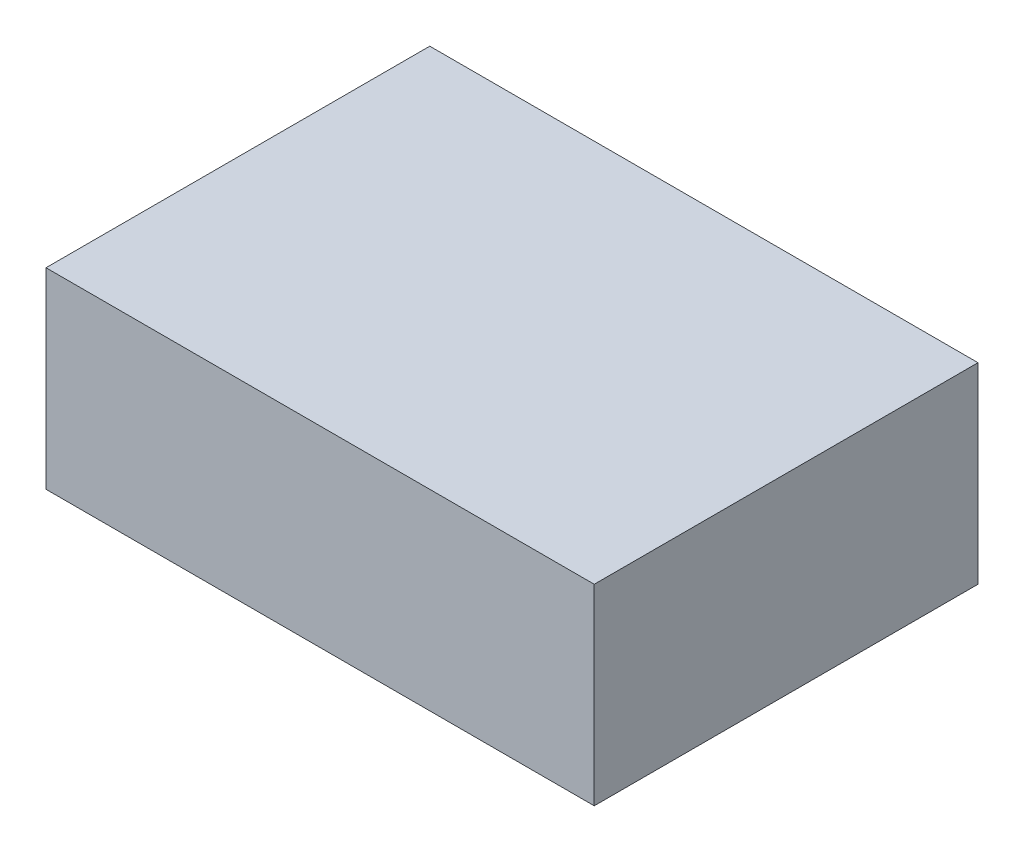
ISO-10303-21;
HEADER;
FILE_DESCRIPTION(('STEP AP214'),'2;1');
FILE_NAME('part.step','',(''),(''),'','','');
FILE_SCHEMA(('AUTOMOTIVE_DESIGN { 1 0 10303 214 1 1 1 1 }'));
ENDSEC;
DATA;
#1=APPLICATION_CONTEXT('core data for automotive mechanical design processes');
#2=APPLICATION_PROTOCOL_DEFINITION('international standard','automotive_design',2000,#1);
#3=PRODUCT_CONTEXT('',#1,'mechanical');
#4=PRODUCT('Part','Part','',(#3));
#5=PRODUCT_RELATED_PRODUCT_CATEGORY('part','',(#4));
#6=PRODUCT_DEFINITION_FORMATION('','',#4);
#7=PRODUCT_DEFINITION_CONTEXT('part definition',#1,'design');
#8=PRODUCT_DEFINITION('design','',#6,#7);
#9=PRODUCT_DEFINITION_SHAPE('','',#8);
#10=(LENGTH_UNIT() NAMED_UNIT(*) SI_UNIT(.MILLI.,.METRE.));
#11=(NAMED_UNIT(*) PLANE_ANGLE_UNIT() SI_UNIT($,.RADIAN.));
#12=(NAMED_UNIT(*) SI_UNIT($,.STERADIAN.) SOLID_ANGLE_UNIT());
#13=UNCERTAINTY_MEASURE_WITH_UNIT(LENGTH_MEASURE(1.E-05),#10,'distance_accuracy_value','');
#14=(GEOMETRIC_REPRESENTATION_CONTEXT(3) GLOBAL_UNCERTAINTY_ASSIGNED_CONTEXT((#13)) GLOBAL_UNIT_ASSIGNED_CONTEXT((#10,
#11,#12)) REPRESENTATION_CONTEXT('',''));
#15=CARTESIAN_POINT('',(0.,0.,0.));
#16=DIRECTION('',(0.,0.,1.));
#17=DIRECTION('',(1.,0.,0.));
#18=AXIS2_PLACEMENT_3D('',#15,#16,#17);
#19=CARTESIAN_POINT('',(50.,35.,-35.));
#20=DIRECTION('',(-1.,0.,0.));
#21=DIRECTION('',(0.,0.,1.));
#22=AXIS2_PLACEMENT_3D('',#19,#20,#21);
#23=PLANE('',#22);
#24=DIRECTION('',(0.,0.,-1.));
#25=VECTOR('',#24,1.);
#26=CARTESIAN_POINT('',(50.,0.,-35.));
#27=LINE('',#26,#25);
#28=CARTESIAN_POINT('',(50.,0.,35.));
#29=VERTEX_POINT('',#28);
#30=CARTESIAN_POINT('',(50.,0.,-35.));
#31=VERTEX_POINT('',#30);
#32=EDGE_CURVE('E97',#29,#31,#27,.T.);
#33=ORIENTED_EDGE('',*,*,#32,.T.);
#34=DIRECTION('',(0.,-1.,0.));
#35=VECTOR('',#34,1.);
#36=CARTESIAN_POINT('',(50.,35.,-35.));
#37=LINE('',#36,#35);
#38=CARTESIAN_POINT('',(50.,35.,-35.));
#39=VERTEX_POINT('',#38);
#40=EDGE_CURVE('E11',#39,#31,#37,.T.);
#41=ORIENTED_EDGE('',*,*,#40,.F.);
#42=DIRECTION('',(0.,0.,-1.));
#43=VECTOR('',#42,1.);
#44=CARTESIAN_POINT('',(50.,35.,-35.));
#45=LINE('',#44,#43);
#46=CARTESIAN_POINT('',(50.,35.,35.));
#47=VERTEX_POINT('',#46);
#48=EDGE_CURVE('E85',#47,#39,#45,.T.);
#49=ORIENTED_EDGE('',*,*,#48,.F.);
#50=DIRECTION('',(0.,-1.,0.));
#51=VECTOR('',#50,1.);
#52=CARTESIAN_POINT('',(50.,35.,35.));
#53=LINE('',#52,#51);
#54=EDGE_CURVE('E93',#47,#29,#53,.T.);
#55=ORIENTED_EDGE('',*,*,#54,.T.);
#56=EDGE_LOOP('',(#33,#41,#49,#55));
#57=FACE_BOUND('',#56,.T.);
#58=ADVANCED_FACE('F34',(#57),#23,.F.);
#59=CARTESIAN_POINT('',(-50.,35.,-35.));
#60=DIRECTION('',(0.,0.,1.));
#61=DIRECTION('',(1.,0.,0.));
#62=AXIS2_PLACEMENT_3D('',#59,#60,#61);
#63=PLANE('',#62);
#64=DIRECTION('',(-1.,0.,0.));
#65=VECTOR('',#64,1.);
#66=CARTESIAN_POINT('',(-50.,0.,-35.));
#67=LINE('',#66,#65);
#68=CARTESIAN_POINT('',(-50.,0.,-35.));
#69=VERTEX_POINT('',#68);
#70=EDGE_CURVE('E89',#31,#69,#67,.T.);
#71=ORIENTED_EDGE('',*,*,#70,.T.);
#72=DIRECTION('',(0.,-1.,0.));
#73=VECTOR('',#72,1.);
#74=CARTESIAN_POINT('',(-50.,35.,-35.));
#75=LINE('',#74,#73);
#76=CARTESIAN_POINT('',(-50.,35.,-35.));
#77=VERTEX_POINT('',#76);
#78=EDGE_CURVE('E42',#77,#69,#75,.T.);
#79=ORIENTED_EDGE('',*,*,#78,.F.);
#80=DIRECTION('',(-1.,0.,0.));
#81=VECTOR('',#80,1.);
#82=CARTESIAN_POINT('',(-50.,35.,-35.));
#83=LINE('',#82,#81);
#84=EDGE_CURVE('E80',#39,#77,#83,.T.);
#85=ORIENTED_EDGE('',*,*,#84,.F.);
#86=ORIENTED_EDGE('',*,*,#40,.T.);
#87=EDGE_LOOP('',(#71,#79,#85,#86));
#88=FACE_BOUND('',#87,.T.);
#89=ADVANCED_FACE('F88',(#88),#63,.F.);
#90=CARTESIAN_POINT('',(-50.,35.,-35.));
#91=DIRECTION('',(1.,0.,0.));
#92=DIRECTION('',(0.,0.,-1.));
#93=AXIS2_PLACEMENT_3D('',#90,#91,#92);
#94=PLANE('',#93);
#95=DIRECTION('',(0.,0.,1.));
#96=VECTOR('',#95,1.);
#97=CARTESIAN_POINT('',(-50.,0.,-35.));
#98=LINE('',#97,#96);
#99=CARTESIAN_POINT('',(-50.,0.,35.));
#100=VERTEX_POINT('',#99);
#101=EDGE_CURVE('E67',#69,#100,#98,.T.);
#102=ORIENTED_EDGE('',*,*,#101,.T.);
#103=DIRECTION('',(0.,-1.,0.));
#104=VECTOR('',#103,1.);
#105=CARTESIAN_POINT('',(-50.,35.,35.));
#106=LINE('',#105,#104);
#107=CARTESIAN_POINT('',(-50.,35.,35.));
#108=VERTEX_POINT('',#107);
#109=EDGE_CURVE('E90',#108,#100,#106,.T.);
#110=ORIENTED_EDGE('',*,*,#109,.F.);
#111=DIRECTION('',(0.,0.,1.));
#112=VECTOR('',#111,1.);
#113=CARTESIAN_POINT('',(-50.,35.,-35.));
#114=LINE('',#113,#112);
#115=EDGE_CURVE('E83',#77,#108,#114,.T.);
#116=ORIENTED_EDGE('',*,*,#115,.F.);
#117=ORIENTED_EDGE('',*,*,#78,.T.);
#118=EDGE_LOOP('',(#102,#110,#116,#117));
#119=FACE_BOUND('',#118,.T.);
#120=ADVANCED_FACE('F91',(#119),#94,.F.);
#121=CARTESIAN_POINT('',(-50.,35.,35.));
#122=DIRECTION('',(0.,0.,-1.));
#123=DIRECTION('',(-1.,0.,0.));
#124=AXIS2_PLACEMENT_3D('',#121,#122,#123);
#125=PLANE('',#124);
#126=DIRECTION('',(1.,0.,0.));
#127=VECTOR('',#126,1.);
#128=CARTESIAN_POINT('',(-50.,0.,35.));
#129=LINE('',#128,#127);
#130=EDGE_CURVE('E73',#100,#29,#129,.T.);
#131=ORIENTED_EDGE('',*,*,#130,.T.);
#132=ORIENTED_EDGE('',*,*,#54,.F.);
#133=DIRECTION('',(1.,0.,0.));
#134=VECTOR('',#133,1.);
#135=CARTESIAN_POINT('',(-50.,35.,35.));
#136=LINE('',#135,#134);
#137=EDGE_CURVE('E50',#108,#47,#136,.T.);
#138=ORIENTED_EDGE('',*,*,#137,.F.);
#139=ORIENTED_EDGE('',*,*,#109,.T.);
#140=EDGE_LOOP('',(#131,#132,#138,#139));
#141=FACE_BOUND('',#140,.T.);
#142=ADVANCED_FACE('F104',(#141),#125,.F.);
#143=CARTESIAN_POINT('',(0.,35.,0.));
#144=DIRECTION('',(0.,1.,0.));
#145=DIRECTION('',(0.,0.,1.));
#146=AXIS2_PLACEMENT_3D('',#143,#144,#145);
#147=PLANE('',#146);
#148=ORIENTED_EDGE('',*,*,#48,.T.);
#149=ORIENTED_EDGE('',*,*,#84,.T.);
#150=ORIENTED_EDGE('',*,*,#115,.T.);
#151=ORIENTED_EDGE('',*,*,#137,.T.);
#152=EDGE_LOOP('',(#148,#149,#150,#151));
#153=FACE_BOUND('',#152,.T.);
#154=ADVANCED_FACE('F81',(#153),#147,.T.);
#155=CARTESIAN_POINT('',(0.,0.,0.));
#156=DIRECTION('',(0.,1.,0.));
#157=DIRECTION('',(0.,0.,1.));
#158=AXIS2_PLACEMENT_3D('',#155,#156,#157);
#159=PLANE('',#158);
#160=ORIENTED_EDGE('',*,*,#32,.F.);
#161=ORIENTED_EDGE('',*,*,#130,.F.);
#162=ORIENTED_EDGE('',*,*,#101,.F.);
#163=ORIENTED_EDGE('',*,*,#70,.F.);
#164=EDGE_LOOP('',(#160,#161,#162,#163));
#165=FACE_BOUND('',#164,.T.);
#166=ADVANCED_FACE('F107',(#165),#159,.F.);
#167=CLOSED_SHELL('',(#58,#89,#120,#142,#154,#166));
#168=MANIFOLD_SOLID_BREP('B2',#167);
#169=ADVANCED_BREP_SHAPE_REPRESENTATION('',(#18,#168),#14);
#170=SHAPE_DEFINITION_REPRESENTATION(#9,#169);
ENDSEC;
END-ISO-10303-21;
